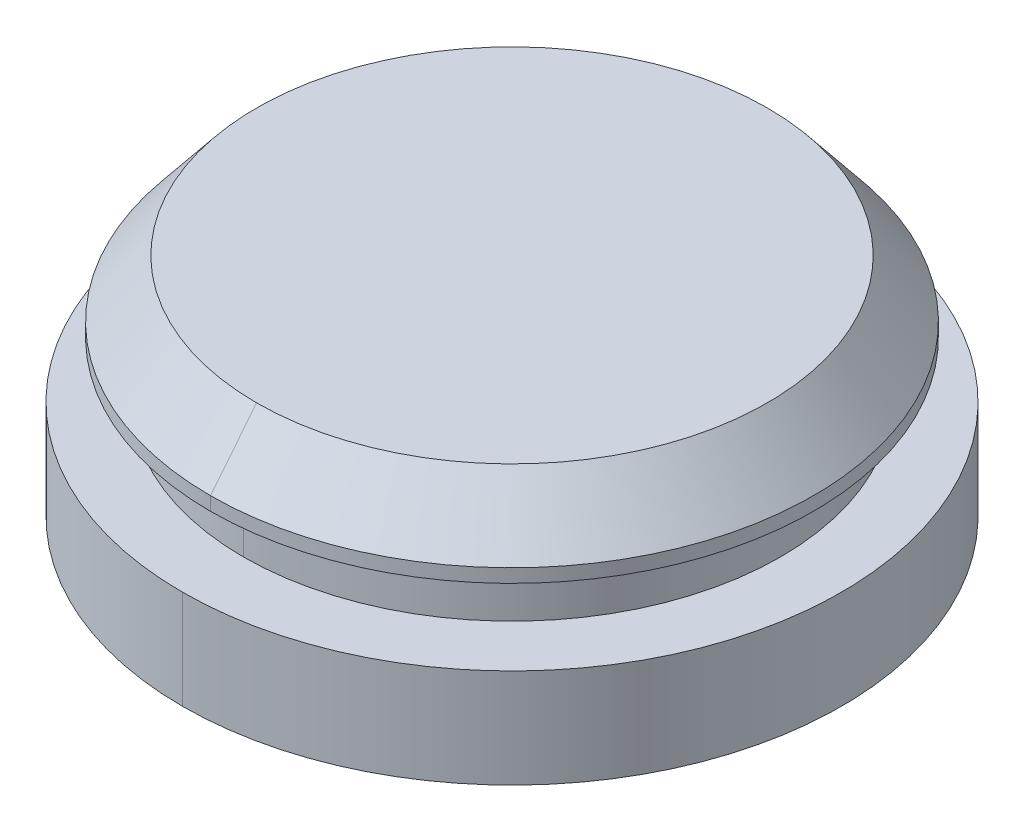
ISO-10303-21;
HEADER;
FILE_DESCRIPTION(('STEP AP214'),'2;1');
FILE_NAME('part.step','',(''),(''),'','','');
FILE_SCHEMA(('AUTOMOTIVE_DESIGN { 1 0 10303 214 1 1 1 1 }'));
ENDSEC;
DATA;
#1=APPLICATION_CONTEXT('core data for automotive mechanical design processes');
#2=APPLICATION_PROTOCOL_DEFINITION('international standard','automotive_design',2000,#1);
#3=PRODUCT_CONTEXT('',#1,'mechanical');
#4=PRODUCT('Part','Part','',(#3));
#5=PRODUCT_RELATED_PRODUCT_CATEGORY('part','',(#4));
#6=PRODUCT_DEFINITION_FORMATION('','',#4);
#7=PRODUCT_DEFINITION_CONTEXT('part definition',#1,'design');
#8=PRODUCT_DEFINITION('design','',#6,#7);
#9=PRODUCT_DEFINITION_SHAPE('','',#8);
#10=(LENGTH_UNIT() NAMED_UNIT(*) SI_UNIT(.MILLI.,.METRE.));
#11=(NAMED_UNIT(*) PLANE_ANGLE_UNIT() SI_UNIT($,.RADIAN.));
#12=(NAMED_UNIT(*) SI_UNIT($,.STERADIAN.) SOLID_ANGLE_UNIT());
#13=UNCERTAINTY_MEASURE_WITH_UNIT(LENGTH_MEASURE(1.E-05),#10,'distance_accuracy_value','');
#14=(GEOMETRIC_REPRESENTATION_CONTEXT(3) GLOBAL_UNCERTAINTY_ASSIGNED_CONTEXT((#13)) GLOBAL_UNIT_ASSIGNED_CONTEXT((#10,
#11,#12)) REPRESENTATION_CONTEXT('',''));
#15=CARTESIAN_POINT('',(0.,0.,0.));
#16=DIRECTION('',(0.,0.,1.));
#17=DIRECTION('',(1.,0.,0.));
#18=AXIS2_PLACEMENT_3D('',#15,#16,#17);
#19=CARTESIAN_POINT('',(0.,3.85,0.));
#20=DIRECTION('',(0.,-1.,0.));
#21=DIRECTION('',(0.,0.,-1.));
#22=AXIS2_PLACEMENT_3D('',#19,#20,#21);
#23=PLANE('',#22);
#24=CARTESIAN_POINT('',(0.,3.85,0.));
#25=DIRECTION('',(0.,-1.,0.));
#26=DIRECTION('',(0.,0.,-1.));
#27=AXIS2_PLACEMENT_3D('',#24,#25,#26);
#28=CIRCLE('',#27,7.75);
#29=CARTESIAN_POINT('',(0.,3.85,7.75));
#30=VERTEX_POINT('',#29);
#31=CARTESIAN_POINT('',(0.,3.85,-7.75));
#32=VERTEX_POINT('',#31);
#33=EDGE_CURVE('E11',#30,#32,#28,.T.);
#34=ORIENTED_EDGE('',*,*,#33,.F.);
#35=CARTESIAN_POINT('',(0.,3.85,0.));
#36=DIRECTION('',(0.,-1.,0.));
#37=DIRECTION('',(0.,0.,-1.));
#38=AXIS2_PLACEMENT_3D('',#35,#36,#37);
#39=CIRCLE('',#38,7.75);
#40=EDGE_CURVE('E25',#32,#30,#39,.T.);
#41=ORIENTED_EDGE('',*,*,#40,.F.);
#42=EDGE_LOOP('',(#34,#41));
#43=FACE_BOUND('',#42,.T.);
#44=ADVANCED_FACE('F17',(#43),#23,.F.);
#45=CARTESIAN_POINT('',(0.,3.85,0.));
#46=DIRECTION('',(0.,-1.,0.));
#47=DIRECTION('',(-1.,0.,0.));
#48=AXIS2_PLACEMENT_3D('',#45,#46,#47);
#49=CONICAL_SURFACE('',#48,7.75,0.677711348549412);
#50=DIRECTION('',(0.,-0.77900976912808,0.627011785856547));
#51=VECTOR('',#50,1.);
#52=CARTESIAN_POINT('',(0.,3.85,7.75));
#53=LINE('',#52,#51);
#54=CARTESIAN_POINT('',(0.,2.1106169431258,9.15));
#55=VERTEX_POINT('',#54);
#56=EDGE_CURVE('E179',#30,#55,#53,.T.);
#57=ORIENTED_EDGE('',*,*,#56,.T.);
#58=CARTESIAN_POINT('',(0.,2.1106169431258,0.));
#59=DIRECTION('',(0.,-1.,0.));
#60=DIRECTION('',(0.,0.,-1.));
#61=AXIS2_PLACEMENT_3D('',#58,#59,#60);
#62=CIRCLE('',#61,9.15);
#63=CARTESIAN_POINT('',(0.,2.1106169431258,-9.15));
#64=VERTEX_POINT('',#63);
#65=EDGE_CURVE('E174',#64,#55,#62,.T.);
#66=ORIENTED_EDGE('',*,*,#65,.F.);
#67=DIRECTION('',(0.,-0.77900976912808,-0.627011785856547));
#68=VECTOR('',#67,1.);
#69=CARTESIAN_POINT('',(0.,3.85,-7.75));
#70=LINE('',#69,#68);
#71=EDGE_CURVE('E169',#32,#64,#70,.T.);
#72=ORIENTED_EDGE('',*,*,#71,.F.);
#73=ORIENTED_EDGE('',*,*,#40,.T.);
#74=EDGE_LOOP('',(#57,#66,#72,#73));
#75=FACE_BOUND('',#74,.T.);
#76=ADVANCED_FACE('F188',(#75),#49,.T.);
#77=CARTESIAN_POINT('',(0.,3.85,0.));
#78=DIRECTION('',(0.,-1.,0.));
#79=DIRECTION('',(1.,0.,0.));
#80=AXIS2_PLACEMENT_3D('',#77,#78,#79);
#81=CONICAL_SURFACE('',#80,7.75,0.677711348549412);
#82=ORIENTED_EDGE('',*,*,#56,.F.);
#83=ORIENTED_EDGE('',*,*,#33,.T.);
#84=ORIENTED_EDGE('',*,*,#71,.T.);
#85=CARTESIAN_POINT('',(0.,2.1106169431258,0.));
#86=DIRECTION('',(0.,-1.,0.));
#87=DIRECTION('',(0.,0.,-1.));
#88=AXIS2_PLACEMENT_3D('',#85,#86,#87);
#89=CIRCLE('',#88,9.15);
#90=EDGE_CURVE('E164',#55,#64,#89,.T.);
#91=ORIENTED_EDGE('',*,*,#90,.F.);
#92=EDGE_LOOP('',(#82,#83,#84,#91));
#93=FACE_BOUND('',#92,.T.);
#94=ADVANCED_FACE('F191',(#93),#81,.T.);
#95=CARTESIAN_POINT('',(0.,-3.,0.));
#96=DIRECTION('',(0.,-1.,0.));
#97=DIRECTION('',(1.,0.,0.));
#98=AXIS2_PLACEMENT_3D('',#95,#96,#97);
#99=CYLINDRICAL_SURFACE('',#98,9.15);
#100=DIRECTION('',(0.,-1.,0.));
#101=VECTOR('',#100,1.);
#102=CARTESIAN_POINT('',(0.,2.1106169431258,9.15));
#103=LINE('',#102,#101);
#104=CARTESIAN_POINT('',(0.,1.699991709637,9.15));
#105=VERTEX_POINT('',#104);
#106=EDGE_CURVE('E159',#55,#105,#103,.T.);
#107=ORIENTED_EDGE('',*,*,#106,.F.);
#108=ORIENTED_EDGE('',*,*,#90,.T.);
#109=DIRECTION('',(0.,-1.,0.));
#110=VECTOR('',#109,1.);
#111=CARTESIAN_POINT('',(0.,2.1106169431258,-9.15));
#112=LINE('',#111,#110);
#113=CARTESIAN_POINT('',(0.,1.699991709637,-9.15));
#114=VERTEX_POINT('',#113);
#115=EDGE_CURVE('E155',#64,#114,#112,.T.);
#116=ORIENTED_EDGE('',*,*,#115,.T.);
#117=CARTESIAN_POINT('',(0.,1.699991709637,0.));
#118=DIRECTION('',(0.,-1.,0.));
#119=DIRECTION('',(0.,0.,-1.));
#120=AXIS2_PLACEMENT_3D('',#117,#118,#119);
#121=CIRCLE('',#120,9.15);
#122=EDGE_CURVE('E150',#105,#114,#121,.T.);
#123=ORIENTED_EDGE('',*,*,#122,.F.);
#124=EDGE_LOOP('',(#107,#108,#116,#123));
#125=FACE_BOUND('',#124,.T.);
#126=ADVANCED_FACE('F195',(#125),#99,.T.);
#127=CARTESIAN_POINT('',(0.,1.699991709637,0.));
#128=DIRECTION('',(0.,1.,0.));
#129=DIRECTION('',(1.,0.,0.));
#130=AXIS2_PLACEMENT_3D('',#127,#128,#129);
#131=CONICAL_SURFACE('',#130,9.15,1.19029709656762);
#132=DIRECTION('',(0.,0.371384040628404,-0.928479345148033));
#133=VECTOR('',#132,1.);
#134=CARTESIAN_POINT('',(0.,1.3,-8.15));
#135=LINE('',#134,#133);
#136=CARTESIAN_POINT('',(0.,1.3,-8.15));
#137=VERTEX_POINT('',#136);
#138=EDGE_CURVE('E145',#137,#114,#135,.T.);
#139=ORIENTED_EDGE('',*,*,#138,.F.);
#140=CARTESIAN_POINT('',(0.,1.3,0.));
#141=DIRECTION('',(0.,-1.,0.));
#142=DIRECTION('',(0.,0.,-1.));
#143=AXIS2_PLACEMENT_3D('',#140,#141,#142);
#144=CIRCLE('',#143,8.15);
#145=CARTESIAN_POINT('',(0.,1.3,8.15));
#146=VERTEX_POINT('',#145);
#147=EDGE_CURVE('E140',#146,#137,#144,.T.);
#148=ORIENTED_EDGE('',*,*,#147,.F.);
#149=DIRECTION('',(0.,0.371384040628404,0.928479345148033));
#150=VECTOR('',#149,1.);
#151=CARTESIAN_POINT('',(0.,1.3,8.15));
#152=LINE('',#151,#150);
#153=EDGE_CURVE('E135',#146,#105,#152,.T.);
#154=ORIENTED_EDGE('',*,*,#153,.T.);
#155=ORIENTED_EDGE('',*,*,#122,.T.);
#156=EDGE_LOOP('',(#139,#148,#154,#155));
#157=FACE_BOUND('',#156,.T.);
#158=ADVANCED_FACE('F205',(#157),#131,.T.);
#159=CARTESIAN_POINT('',(0.,1.699991709637,0.));
#160=DIRECTION('',(0.,1.,0.));
#161=DIRECTION('',(-1.,0.,0.));
#162=AXIS2_PLACEMENT_3D('',#159,#160,#161);
#163=CONICAL_SURFACE('',#162,9.15,1.19029709656762);
#164=ORIENTED_EDGE('',*,*,#138,.T.);
#165=CARTESIAN_POINT('',(0.,1.699991709637,0.));
#166=DIRECTION('',(0.,-1.,0.));
#167=DIRECTION('',(0.,0.,-1.));
#168=AXIS2_PLACEMENT_3D('',#165,#166,#167);
#169=CIRCLE('',#168,9.15);
#170=EDGE_CURVE('E130',#114,#105,#169,.T.);
#171=ORIENTED_EDGE('',*,*,#170,.T.);
#172=ORIENTED_EDGE('',*,*,#153,.F.);
#173=CARTESIAN_POINT('',(0.,1.3,0.));
#174=DIRECTION('',(0.,-1.,0.));
#175=DIRECTION('',(0.,0.,-1.));
#176=AXIS2_PLACEMENT_3D('',#173,#174,#175);
#177=CIRCLE('',#176,8.15);
#178=EDGE_CURVE('E125',#137,#146,#177,.T.);
#179=ORIENTED_EDGE('',*,*,#178,.F.);
#180=EDGE_LOOP('',(#164,#171,#172,#179));
#181=FACE_BOUND('',#180,.T.);
#182=ADVANCED_FACE('F202',(#181),#163,.T.);
#183=CARTESIAN_POINT('',(0.,-3.,0.));
#184=DIRECTION('',(0.,-1.,0.));
#185=DIRECTION('',(-1.,0.,0.));
#186=AXIS2_PLACEMENT_3D('',#183,#184,#185);
#187=CYLINDRICAL_SURFACE('',#186,8.15);
#188=DIRECTION('',(0.,-1.,0.));
#189=VECTOR('',#188,1.);
#190=CARTESIAN_POINT('',(0.,1.3,8.15));
#191=LINE('',#190,#189);
#192=CARTESIAN_POINT('',(0.,0.,8.15));
#193=VERTEX_POINT('',#192);
#194=EDGE_CURVE('E121',#146,#193,#191,.T.);
#195=ORIENTED_EDGE('',*,*,#194,.T.);
#196=CARTESIAN_POINT('',(0.,0.,0.));
#197=DIRECTION('',(0.,-1.,0.));
#198=DIRECTION('',(0.,0.,-1.));
#199=AXIS2_PLACEMENT_3D('',#196,#197,#198);
#200=CIRCLE('',#199,8.15);
#201=CARTESIAN_POINT('',(0.,0.,-8.15));
#202=VERTEX_POINT('',#201);
#203=EDGE_CURVE('E116',#202,#193,#200,.T.);
#204=ORIENTED_EDGE('',*,*,#203,.F.);
#205=DIRECTION('',(0.,-1.,0.));
#206=VECTOR('',#205,1.);
#207=CARTESIAN_POINT('',(0.,1.3,-8.15));
#208=LINE('',#207,#206);
#209=EDGE_CURVE('E111',#137,#202,#208,.T.);
#210=ORIENTED_EDGE('',*,*,#209,.F.);
#211=ORIENTED_EDGE('',*,*,#178,.T.);
#212=EDGE_LOOP('',(#195,#204,#210,#211));
#213=FACE_BOUND('',#212,.T.);
#214=ADVANCED_FACE('F211',(#213),#187,.T.);
#215=CARTESIAN_POINT('',(0.,-3.,0.));
#216=DIRECTION('',(0.,-1.,0.));
#217=DIRECTION('',(1.,0.,0.));
#218=AXIS2_PLACEMENT_3D('',#215,#216,#217);
#219=CYLINDRICAL_SURFACE('',#218,8.15);
#220=ORIENTED_EDGE('',*,*,#194,.F.);
#221=ORIENTED_EDGE('',*,*,#147,.T.);
#222=ORIENTED_EDGE('',*,*,#209,.T.);
#223=CARTESIAN_POINT('',(0.,0.,0.));
#224=DIRECTION('',(0.,-1.,0.));
#225=DIRECTION('',(0.,0.,-1.));
#226=AXIS2_PLACEMENT_3D('',#223,#224,#225);
#227=CIRCLE('',#226,8.15);
#228=EDGE_CURVE('E106',#193,#202,#227,.T.);
#229=ORIENTED_EDGE('',*,*,#228,.F.);
#230=EDGE_LOOP('',(#220,#221,#222,#229));
#231=FACE_BOUND('',#230,.T.);
#232=ADVANCED_FACE('F209',(#231),#219,.T.);
#233=CARTESIAN_POINT('',(8.15,0.,0.));
#234=DIRECTION('',(0.,-1.,0.));
#235=DIRECTION('',(0.,0.,-1.));
#236=AXIS2_PLACEMENT_3D('',#233,#234,#235);
#237=PLANE('',#236);
#238=CARTESIAN_POINT('',(0.,0.,0.));
#239=DIRECTION('',(0.,-1.,0.));
#240=DIRECTION('',(0.,0.,-1.));
#241=AXIS2_PLACEMENT_3D('',#238,#239,#240);
#242=CIRCLE('',#241,10.);
#243=CARTESIAN_POINT('',(0.,0.,10.));
#244=VERTEX_POINT('',#243);
#245=CARTESIAN_POINT('',(0.,0.,-10.));
#246=VERTEX_POINT('',#245);
#247=EDGE_CURVE('E87',#244,#246,#242,.T.);
#248=ORIENTED_EDGE('',*,*,#247,.F.);
#249=CARTESIAN_POINT('',(0.,0.,0.));
#250=DIRECTION('',(0.,-1.,0.));
#251=DIRECTION('',(0.,0.,-1.));
#252=AXIS2_PLACEMENT_3D('',#249,#250,#251);
#253=CIRCLE('',#252,10.);
#254=EDGE_CURVE('E99',#246,#244,#253,.T.);
#255=ORIENTED_EDGE('',*,*,#254,.F.);
#256=EDGE_LOOP('',(#248,#255));
#257=FACE_BOUND('',#256,.T.);
#258=ORIENTED_EDGE('',*,*,#203,.T.);
#259=ORIENTED_EDGE('',*,*,#228,.T.);
#260=EDGE_LOOP('',(#258,#259));
#261=FACE_BOUND('',#260,.T.);
#262=ADVANCED_FACE('F213',(#257,#261),#237,.F.);
#263=CARTESIAN_POINT('',(0.,-3.,0.));
#264=DIRECTION('',(0.,-1.,0.));
#265=DIRECTION('',(-1.,0.,0.));
#266=AXIS2_PLACEMENT_3D('',#263,#264,#265);
#267=CYLINDRICAL_SURFACE('',#266,10.);
#268=DIRECTION('',(0.,-1.,0.));
#269=VECTOR('',#268,1.);
#270=CARTESIAN_POINT('',(0.,0.,10.));
#271=LINE('',#270,#269);
#272=CARTESIAN_POINT('',(0.,-3.,10.));
#273=VERTEX_POINT('',#272);
#274=EDGE_CURVE('E79',#244,#273,#271,.T.);
#275=ORIENTED_EDGE('',*,*,#274,.T.);
#276=CARTESIAN_POINT('',(0.,-3.,0.));
#277=DIRECTION('',(0.,-1.,0.));
#278=DIRECTION('',(0.,0.,-1.));
#279=AXIS2_PLACEMENT_3D('',#276,#277,#278);
#280=CIRCLE('',#279,10.);
#281=CARTESIAN_POINT('',(0.,-3.,-10.));
#282=VERTEX_POINT('',#281);
#283=EDGE_CURVE('E72',#282,#273,#280,.T.);
#284=ORIENTED_EDGE('',*,*,#283,.F.);
#285=DIRECTION('',(0.,-1.,0.));
#286=VECTOR('',#285,1.);
#287=CARTESIAN_POINT('',(0.,0.,-10.));
#288=LINE('',#287,#286);
#289=EDGE_CURVE('E76',#246,#282,#288,.T.);
#290=ORIENTED_EDGE('',*,*,#289,.F.);
#291=ORIENTED_EDGE('',*,*,#254,.T.);
#292=EDGE_LOOP('',(#275,#284,#290,#291));
#293=FACE_BOUND('',#292,.T.);
#294=ADVANCED_FACE('F74',(#293),#267,.T.);
#295=CARTESIAN_POINT('',(0.,-3.,0.));
#296=DIRECTION('',(0.,-1.,0.));
#297=DIRECTION('',(1.,0.,0.));
#298=AXIS2_PLACEMENT_3D('',#295,#296,#297);
#299=CYLINDRICAL_SURFACE('',#298,10.);
#300=ORIENTED_EDGE('',*,*,#274,.F.);
#301=ORIENTED_EDGE('',*,*,#247,.T.);
#302=ORIENTED_EDGE('',*,*,#289,.T.);
#303=CARTESIAN_POINT('',(0.,-3.,0.));
#304=DIRECTION('',(0.,-1.,0.));
#305=DIRECTION('',(0.,0.,-1.));
#306=AXIS2_PLACEMENT_3D('',#303,#304,#305);
#307=CIRCLE('',#306,10.);
#308=EDGE_CURVE('E86',#273,#282,#307,.T.);
#309=ORIENTED_EDGE('',*,*,#308,.F.);
#310=EDGE_LOOP('',(#300,#301,#302,#309));
#311=FACE_BOUND('',#310,.T.);
#312=ADVANCED_FACE('F85',(#311),#299,.T.);
#313=CARTESIAN_POINT('',(10.,-3.,0.));
#314=DIRECTION('',(0.,1.,0.));
#315=DIRECTION('',(0.,0.,1.));
#316=AXIS2_PLACEMENT_3D('',#313,#314,#315);
#317=PLANE('',#316);
#318=ORIENTED_EDGE('',*,*,#283,.T.);
#319=ORIENTED_EDGE('',*,*,#308,.T.);
#320=EDGE_LOOP('',(#318,#319));
#321=FACE_BOUND('',#320,.T.);
#322=ADVANCED_FACE('F89',(#321),#317,.F.);
#323=CARTESIAN_POINT('',(0.,-3.,0.));
#324=DIRECTION('',(0.,-1.,0.));
#325=DIRECTION('',(-1.,0.,0.));
#326=AXIS2_PLACEMENT_3D('',#323,#324,#325);
#327=CYLINDRICAL_SURFACE('',#326,9.15);
#328=ORIENTED_EDGE('',*,*,#106,.T.);
#329=ORIENTED_EDGE('',*,*,#170,.F.);
#330=ORIENTED_EDGE('',*,*,#115,.F.);
#331=ORIENTED_EDGE('',*,*,#65,.T.);
#332=EDGE_LOOP('',(#328,#329,#330,#331));
#333=FACE_BOUND('',#332,.T.);
#334=ADVANCED_FACE('F198',(#333),#327,.T.);
#335=CLOSED_SHELL('',(#44,#76,#94,#126,#158,#182,#214,#232,#262,#294,#312,#322,#334));
#336=MANIFOLD_SOLID_BREP('B1',#335);
#337=ADVANCED_BREP_SHAPE_REPRESENTATION('',(#18,#336),#14);
#338=SHAPE_DEFINITION_REPRESENTATION(#9,#337);
ENDSEC;
END-ISO-10303-21;
